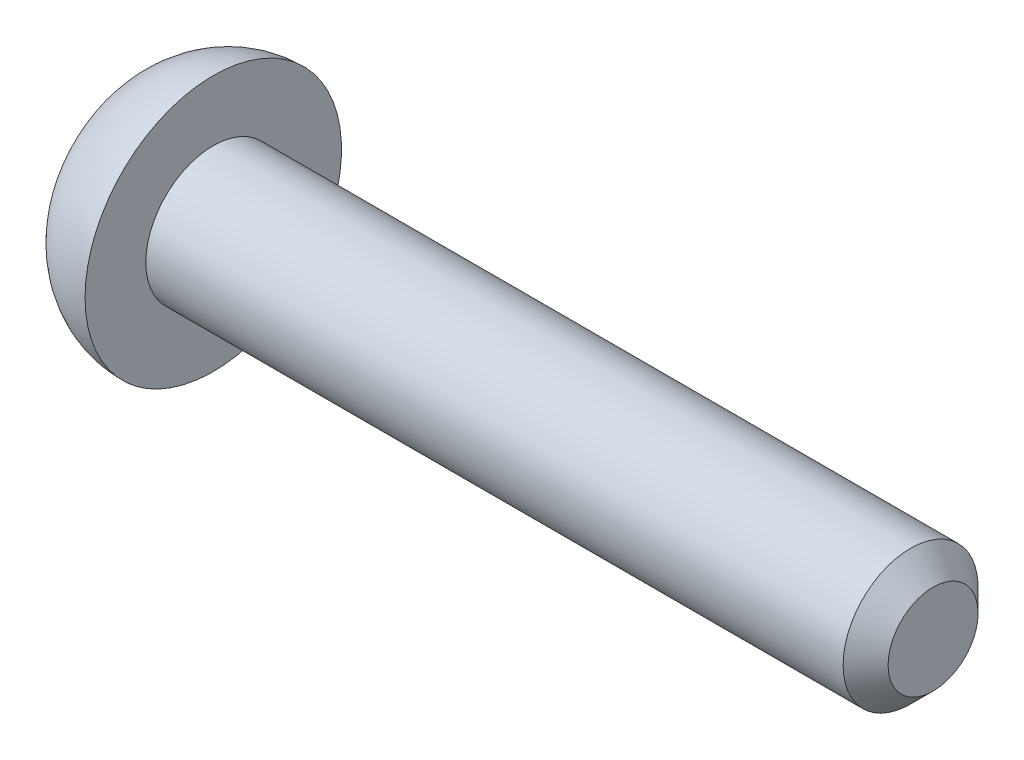
ISO-10303-21;
HEADER;
FILE_DESCRIPTION(('STEP AP214'),'2;1');
FILE_NAME('part.step','',(''),(''),'','','');
FILE_SCHEMA(('AUTOMOTIVE_DESIGN { 1 0 10303 214 1 1 1 1 }'));
ENDSEC;
DATA;
#1=APPLICATION_CONTEXT('core data for automotive mechanical design processes');
#2=APPLICATION_PROTOCOL_DEFINITION('international standard','automotive_design',2000,#1);
#3=PRODUCT_CONTEXT('',#1,'mechanical');
#4=PRODUCT('Part','Part','',(#3));
#5=PRODUCT_RELATED_PRODUCT_CATEGORY('part','',(#4));
#6=PRODUCT_DEFINITION_FORMATION('','',#4);
#7=PRODUCT_DEFINITION_CONTEXT('part definition',#1,'design');
#8=PRODUCT_DEFINITION('design','',#6,#7);
#9=PRODUCT_DEFINITION_SHAPE('','',#8);
#10=(LENGTH_UNIT() NAMED_UNIT(*) SI_UNIT(.MILLI.,.METRE.));
#11=(NAMED_UNIT(*) PLANE_ANGLE_UNIT() SI_UNIT($,.RADIAN.));
#12=(NAMED_UNIT(*) SI_UNIT($,.STERADIAN.) SOLID_ANGLE_UNIT());
#13=UNCERTAINTY_MEASURE_WITH_UNIT(LENGTH_MEASURE(1.E-05),#10,'distance_accuracy_value','');
#14=(GEOMETRIC_REPRESENTATION_CONTEXT(3) GLOBAL_UNCERTAINTY_ASSIGNED_CONTEXT((#13)) GLOBAL_UNIT_ASSIGNED_CONTEXT((#10,
#11,#12)) REPRESENTATION_CONTEXT('',''));
#15=CARTESIAN_POINT('',(0.,0.,0.));
#16=DIRECTION('',(0.,0.,1.));
#17=DIRECTION('',(1.,0.,0.));
#18=AXIS2_PLACEMENT_3D('',#15,#16,#17);
#19=CARTESIAN_POINT('',(-17.65,0.,-2.04903810567667));
#20=DIRECTION('',(1.,0.,0.));
#21=DIRECTION('',(0.,0.,-1.));
#22=AXIS2_PLACEMENT_3D('',#19,#20,#21);
#23=PLANE('',#22);
#24=CARTESIAN_POINT('',(-17.65,0.,0.));
#25=DIRECTION('',(-1.,0.,0.));
#26=DIRECTION('',(0.,0.,1.));
#27=AXIS2_PLACEMENT_3D('',#24,#25,#26);
#28=CIRCLE('',#27,2.04903810567666);
#29=CARTESIAN_POINT('',(-17.65,0.,2.04903810567666));
#30=VERTEX_POINT('',#29);
#31=EDGE_CURVE('E213',#30,#30,#28,.T.);
#32=ORIENTED_EDGE('',*,*,#31,.T.);
#33=EDGE_LOOP('',(#32));
#34=FACE_BOUND('',#33,.T.);
#35=CARTESIAN_POINT('',(-17.65,2.04903810567666,0.));
#36=DIRECTION('',(1.,0.,0.));
#37=DIRECTION('',(0.,0.,1.));
#38=AXIS2_PLACEMENT_3D('',#35,#36,#37);
#39=CIRCLE('',#38,1.02907378905691);
#40=CARTESIAN_POINT('',(-17.65,1.20759961003623,0.592430689092257));
#41=VERTEX_POINT('',#40);
#42=CARTESIAN_POINT('',(-17.65,1.20759961003623,-0.592430689092258));
#43=VERTEX_POINT('',#42);
#44=EDGE_CURVE('E159',#41,#43,#39,.T.);
#45=ORIENTED_EDGE('',*,*,#44,.F.);
#46=CARTESIAN_POINT('',(-17.65,1.12583302491977,0.650000000000001));
#47=DIRECTION('',(-1.,0.,0.));
#48=DIRECTION('',(0.,0.,1.));
#49=AXIS2_PLACEMENT_3D('',#46,#47,#48);
#50=CIRCLE('',#49,0.1);
#51=CARTESIAN_POINT('',(-17.65,1.11685983175353,0.74959659534543));
#52=VERTEX_POINT('',#51);
#53=EDGE_CURVE('E49',#52,#41,#50,.T.);
#54=ORIENTED_EDGE('',*,*,#53,.F.);
#55=CARTESIAN_POINT('',(-17.65,1.02451905283833,1.77451905283833));
#56=DIRECTION('',(1.,0.,0.));
#57=DIRECTION('',(0.,0.,1.));
#58=AXIS2_PLACEMENT_3D('',#55,#56,#57);
#59=CIRCLE('',#58,1.02907378905691);
#60=CARTESIAN_POINT('',(-17.65,0.0907397782827011,1.34202728443769));
#61=VERTEX_POINT('',#60);
#62=EDGE_CURVE('E186',#61,#52,#59,.T.);
#63=ORIENTED_EDGE('',*,*,#62,.F.);
#64=CARTESIAN_POINT('',(-17.65,0.,1.3));
#65=DIRECTION('',(-1.,0.,0.));
#66=DIRECTION('',(0.,0.,1.));
#67=AXIS2_PLACEMENT_3D('',#64,#65,#66);
#68=CIRCLE('',#67,0.1);
#69=CARTESIAN_POINT('',(-17.65,-0.0907397782827009,1.34202728443769));
#70=VERTEX_POINT('',#69);
#71=EDGE_CURVE('E184',#70,#61,#68,.T.);
#72=ORIENTED_EDGE('',*,*,#71,.F.);
#73=CARTESIAN_POINT('',(-17.65,-1.02451905283833,1.77451905283833));
#74=DIRECTION('',(1.,0.,0.));
#75=DIRECTION('',(0.,0.,1.));
#76=AXIS2_PLACEMENT_3D('',#73,#74,#75);
#77=CIRCLE('',#76,1.02907378905691);
#78=CARTESIAN_POINT('',(-17.65,-1.11685983175353,0.74959659534543));
#79=VERTEX_POINT('',#78);
#80=EDGE_CURVE('E133',#79,#70,#77,.T.);
#81=ORIENTED_EDGE('',*,*,#80,.F.);
#82=CARTESIAN_POINT('',(-17.65,-1.12583302491977,0.650000000000001));
#83=DIRECTION('',(-1.,0.,0.));
#84=DIRECTION('',(0.,0.,-1.));
#85=AXIS2_PLACEMENT_3D('',#82,#83,#84);
#86=CIRCLE('',#85,0.0999999999999997);
#87=CARTESIAN_POINT('',(-17.65,-1.20759961003623,0.592430689092258));
#88=VERTEX_POINT('',#87);
#89=EDGE_CURVE('E180',#88,#79,#86,.T.);
#90=ORIENTED_EDGE('',*,*,#89,.F.);
#91=CARTESIAN_POINT('',(-17.65,-2.04903810567666,0.));
#92=DIRECTION('',(1.,0.,0.));
#93=DIRECTION('',(0.,0.,-1.));
#94=AXIS2_PLACEMENT_3D('',#91,#92,#93);
#95=CIRCLE('',#94,1.02907378905691);
#96=CARTESIAN_POINT('',(-17.65,-1.20759961003623,-0.592430689092258));
#97=VERTEX_POINT('',#96);
#98=EDGE_CURVE('E177',#97,#88,#95,.T.);
#99=ORIENTED_EDGE('',*,*,#98,.F.);
#100=CARTESIAN_POINT('',(-17.65,-1.12583302491977,-0.650000000000001));
#101=DIRECTION('',(-1.,0.,0.));
#102=DIRECTION('',(0.,0.,1.));
#103=AXIS2_PLACEMENT_3D('',#100,#101,#102);
#104=CIRCLE('',#103,0.0999999999999999);
#105=CARTESIAN_POINT('',(-17.65,-1.11685983175353,-0.749596595345431));
#106=VERTEX_POINT('',#105);
#107=EDGE_CURVE('E174',#106,#97,#104,.T.);
#108=ORIENTED_EDGE('',*,*,#107,.F.);
#109=CARTESIAN_POINT('',(-17.65,-1.02451905283833,-1.77451905283833));
#110=DIRECTION('',(1.,0.,0.));
#111=DIRECTION('',(0.,0.,1.));
#112=AXIS2_PLACEMENT_3D('',#109,#110,#111);
#113=CIRCLE('',#112,1.02907378905691);
#114=CARTESIAN_POINT('',(-17.65,-0.0907397782827007,-1.34202728443769));
#115=VERTEX_POINT('',#114);
#116=EDGE_CURVE('E171',#115,#106,#113,.T.);
#117=ORIENTED_EDGE('',*,*,#116,.F.);
#118=CARTESIAN_POINT('',(-17.65,0.,-1.3));
#119=DIRECTION('',(-1.,0.,0.));
#120=DIRECTION('',(0.,0.,1.));
#121=AXIS2_PLACEMENT_3D('',#118,#119,#120);
#122=CIRCLE('',#121,0.1);
#123=CARTESIAN_POINT('',(-17.65,0.0907397782827007,-1.34202728443769));
#124=VERTEX_POINT('',#123);
#125=EDGE_CURVE('E168',#124,#115,#122,.T.);
#126=ORIENTED_EDGE('',*,*,#125,.F.);
#127=CARTESIAN_POINT('',(-17.65,1.02451905283833,-1.77451905283833));
#128=DIRECTION('',(1.,0.,0.));
#129=DIRECTION('',(0.,0.,1.));
#130=AXIS2_PLACEMENT_3D('',#127,#128,#129);
#131=CIRCLE('',#130,1.02907378905691);
#132=CARTESIAN_POINT('',(-17.65,1.11685983175353,-0.74959659534543));
#133=VERTEX_POINT('',#132);
#134=EDGE_CURVE('E165',#133,#124,#131,.T.);
#135=ORIENTED_EDGE('',*,*,#134,.F.);
#136=CARTESIAN_POINT('',(-17.65,1.12583302491977,-0.650000000000001));
#137=DIRECTION('',(-1.,0.,0.));
#138=DIRECTION('',(0.,0.,-1.));
#139=AXIS2_PLACEMENT_3D('',#136,#137,#138);
#140=CIRCLE('',#139,0.0999999999999998);
#141=EDGE_CURVE('E162',#43,#133,#140,.T.);
#142=ORIENTED_EDGE('',*,*,#141,.F.);
#143=EDGE_LOOP('',(#45,#54,#63,#72,#81,#90,#99,#108,#117,#126,#135,#142));
#144=FACE_BOUND('',#143,.T.);
#145=ADVANCED_FACE('F34',(#34,#144),#23,.F.);
#146=CARTESIAN_POINT('',(-16.,0.,0.));
#147=DIRECTION('',(-1.,0.,0.));
#148=DIRECTION('',(0.,0.,1.));
#149=AXIS2_PLACEMENT_3D('',#146,#147,#148);
#150=DEGENERATE_TOROIDAL_SURFACE('',#149,0.749999999999999,2.1,.T.);
#151=ORIENTED_EDGE('',*,*,#31,.F.);
#152=EDGE_LOOP('',(#151));
#153=FACE_BOUND('',#152,.T.);
#154=CARTESIAN_POINT('',(-16.,0.,0.));
#155=DIRECTION('',(-1.,0.,0.));
#156=DIRECTION('',(0.,0.,1.));
#157=AXIS2_PLACEMENT_3D('',#154,#155,#156);
#158=CIRCLE('',#157,2.85);
#159=CARTESIAN_POINT('',(-16.,0.,2.85));
#160=VERTEX_POINT('',#159);
#161=EDGE_CURVE('E210',#160,#160,#158,.T.);
#162=ORIENTED_EDGE('',*,*,#161,.T.);
#163=EDGE_LOOP('',(#162));
#164=FACE_BOUND('',#163,.T.);
#165=ADVANCED_FACE('F235',(#153,#164),#150,.T.);
#166=CARTESIAN_POINT('',(-16.,0.,-2.85));
#167=DIRECTION('',(-1.,0.,0.));
#168=DIRECTION('',(0.,0.,1.));
#169=AXIS2_PLACEMENT_3D('',#166,#167,#168);
#170=PLANE('',#169);
#171=ORIENTED_EDGE('',*,*,#161,.F.);
#172=EDGE_LOOP('',(#171));
#173=FACE_BOUND('',#172,.T.);
#174=CARTESIAN_POINT('',(-16.,0.,0.));
#175=DIRECTION('',(-1.,0.,0.));
#176=DIRECTION('',(0.,0.,1.));
#177=AXIS2_PLACEMENT_3D('',#174,#175,#176);
#178=CIRCLE('',#177,1.5);
#179=CARTESIAN_POINT('',(-16.,0.,1.5));
#180=VERTEX_POINT('',#179);
#181=EDGE_CURVE('E190',#180,#180,#178,.T.);
#182=ORIENTED_EDGE('',*,*,#181,.T.);
#183=EDGE_LOOP('',(#182));
#184=FACE_BOUND('',#183,.T.);
#185=ADVANCED_FACE('F240',(#173,#184),#170,.F.);
#186=CARTESIAN_POINT('',(-17.65,0.,0.));
#187=DIRECTION('',(-1.,0.,0.));
#188=DIRECTION('',(0.,0.,1.));
#189=AXIS2_PLACEMENT_3D('',#186,#187,#188);
#190=CYLINDRICAL_SURFACE('',#189,1.5);
#191=CARTESIAN_POINT('',(-0.5,0.,0.));
#192=DIRECTION('',(-1.,0.,0.));
#193=DIRECTION('',(0.,0.,1.));
#194=AXIS2_PLACEMENT_3D('',#191,#192,#193);
#195=CIRCLE('',#194,1.5);
#196=CARTESIAN_POINT('',(-0.5,0.,1.5));
#197=VERTEX_POINT('',#196);
#198=EDGE_CURVE('E42',#197,#197,#195,.T.);
#199=ORIENTED_EDGE('',*,*,#198,.T.);
#200=EDGE_LOOP('',(#199));
#201=FACE_BOUND('',#200,.T.);
#202=ORIENTED_EDGE('',*,*,#181,.F.);
#203=EDGE_LOOP('',(#202));
#204=FACE_BOUND('',#203,.T.);
#205=ADVANCED_FACE('F218',(#201,#204),#190,.T.);
#206=CARTESIAN_POINT('',(0.,0.,0.));
#207=DIRECTION('',(-1.,0.,0.));
#208=DIRECTION('',(0.,0.,1.));
#209=AXIS2_PLACEMENT_3D('',#206,#207,#208);
#210=PLANE('',#209);
#211=CARTESIAN_POINT('',(0.,0.,0.));
#212=DIRECTION('',(-1.,0.,0.));
#213=DIRECTION('',(0.,0.,1.));
#214=AXIS2_PLACEMENT_3D('',#211,#212,#213);
#215=CIRCLE('',#214,0.999999999999996);
#216=CARTESIAN_POINT('',(0.,0.,0.999999999999996));
#217=VERTEX_POINT('',#216);
#218=EDGE_CURVE('E11',#217,#217,#215,.F.);
#219=ORIENTED_EDGE('',*,*,#218,.T.);
#220=EDGE_LOOP('',(#219));
#221=FACE_BOUND('',#220,.T.);
#222=ADVANCED_FACE('F223',(#221),#210,.F.);
#223=CARTESIAN_POINT('',(-0.5,0.,0.));
#224=DIRECTION('',(-1.,0.,0.));
#225=DIRECTION('',(0.,0.,1.));
#226=AXIS2_PLACEMENT_3D('',#223,#224,#225);
#227=CONICAL_SURFACE('',#226,1.5,0.785398163397451);
#228=ORIENTED_EDGE('',*,*,#218,.F.);
#229=EDGE_LOOP('',(#228));
#230=FACE_BOUND('',#229,.T.);
#231=ORIENTED_EDGE('',*,*,#198,.F.);
#232=EDGE_LOOP('',(#231));
#233=FACE_BOUND('',#232,.T.);
#234=ADVANCED_FACE('F36',(#230,#233),#227,.T.);
#235=CARTESIAN_POINT('',(-16.65,1.12583302491977,0.650000000000001));
#236=DIRECTION('',(-1.,0.,0.));
#237=DIRECTION('',(0.,0.,1.));
#238=AXIS2_PLACEMENT_3D('',#235,#236,#237);
#239=CYLINDRICAL_SURFACE('',#238,0.1);
#240=ORIENTED_EDGE('',*,*,#53,.T.);
#241=DIRECTION('',(-1.,0.,0.));
#242=VECTOR('',#241,1.);
#243=CARTESIAN_POINT('',(-16.65,1.20759961003623,0.592430689092257));
#244=LINE('',#243,#242);
#245=CARTESIAN_POINT('',(-16.65,1.20759961003623,0.592430689092257));
#246=VERTEX_POINT('',#245);
#247=EDGE_CURVE('E97',#246,#41,#244,.T.);
#248=ORIENTED_EDGE('',*,*,#247,.F.);
#249=CARTESIAN_POINT('',(-16.65,1.12583302491977,0.650000000000001));
#250=DIRECTION('',(-1.,0.,0.));
#251=DIRECTION('',(0.,0.,1.));
#252=AXIS2_PLACEMENT_3D('',#249,#250,#251);
#253=CIRCLE('',#252,0.1);
#254=CARTESIAN_POINT('',(-16.65,1.11685983175353,0.74959659534543));
#255=VERTEX_POINT('',#254);
#256=EDGE_CURVE('E188',#255,#246,#253,.T.);
#257=ORIENTED_EDGE('',*,*,#256,.F.);
#258=DIRECTION('',(-1.,0.,0.));
#259=VECTOR('',#258,1.);
#260=CARTESIAN_POINT('',(-16.65,1.11685983175353,0.74959659534543));
#261=LINE('',#260,#259);
#262=EDGE_CURVE('E57',#255,#52,#261,.T.);
#263=ORIENTED_EDGE('',*,*,#262,.T.);
#264=EDGE_LOOP('',(#240,#248,#257,#263));
#265=FACE_BOUND('',#264,.T.);
#266=ADVANCED_FACE('F222',(#265),#239,.F.);
#267=CARTESIAN_POINT('',(-16.65,1.02451905283833,1.77451905283833));
#268=DIRECTION('',(-1.,0.,0.));
#269=DIRECTION('',(0.,0.,1.));
#270=AXIS2_PLACEMENT_3D('',#267,#268,#269);
#271=CYLINDRICAL_SURFACE('',#270,1.02907378905691);
#272=ORIENTED_EDGE('',*,*,#62,.T.);
#273=ORIENTED_EDGE('',*,*,#262,.F.);
#274=CARTESIAN_POINT('',(-16.65,1.02451905283833,1.77451905283833));
#275=DIRECTION('',(1.,0.,0.));
#276=DIRECTION('',(0.,0.,1.));
#277=AXIS2_PLACEMENT_3D('',#274,#275,#276);
#278=CIRCLE('',#277,1.02907378905691);
#279=CARTESIAN_POINT('',(-16.65,0.0907397782827011,1.34202728443769));
#280=VERTEX_POINT('',#279);
#281=EDGE_CURVE('E145',#280,#255,#278,.T.);
#282=ORIENTED_EDGE('',*,*,#281,.F.);
#283=DIRECTION('',(-1.,0.,0.));
#284=VECTOR('',#283,1.);
#285=CARTESIAN_POINT('',(-16.65,0.0907397782827011,1.34202728443769));
#286=LINE('',#285,#284);
#287=EDGE_CURVE('E137',#280,#61,#286,.T.);
#288=ORIENTED_EDGE('',*,*,#287,.T.);
#289=EDGE_LOOP('',(#272,#273,#282,#288));
#290=FACE_BOUND('',#289,.T.);
#291=ADVANCED_FACE('F229',(#290),#271,.T.);
#292=CARTESIAN_POINT('',(-16.65,0.,1.3));
#293=DIRECTION('',(-1.,0.,0.));
#294=DIRECTION('',(0.,0.,1.));
#295=AXIS2_PLACEMENT_3D('',#292,#293,#294);
#296=CYLINDRICAL_SURFACE('',#295,0.1);
#297=ORIENTED_EDGE('',*,*,#71,.T.);
#298=ORIENTED_EDGE('',*,*,#287,.F.);
#299=CARTESIAN_POINT('',(-16.65,0.,1.3));
#300=DIRECTION('',(-1.,0.,0.));
#301=DIRECTION('',(0.,0.,1.));
#302=AXIS2_PLACEMENT_3D('',#299,#300,#301);
#303=CIRCLE('',#302,0.1);
#304=CARTESIAN_POINT('',(-16.65,-0.0907397782827009,1.34202728443769));
#305=VERTEX_POINT('',#304);
#306=EDGE_CURVE('E141',#305,#280,#303,.T.);
#307=ORIENTED_EDGE('',*,*,#306,.F.);
#308=DIRECTION('',(-1.,0.,0.));
#309=VECTOR('',#308,1.);
#310=CARTESIAN_POINT('',(-16.65,-0.0907397782827009,1.34202728443769));
#311=LINE('',#310,#309);
#312=EDGE_CURVE('E126',#305,#70,#311,.T.);
#313=ORIENTED_EDGE('',*,*,#312,.T.);
#314=EDGE_LOOP('',(#297,#298,#307,#313));
#315=FACE_BOUND('',#314,.T.);
#316=ADVANCED_FACE('F142',(#315),#296,.F.);
#317=CARTESIAN_POINT('',(-16.65,-1.02451905283833,1.77451905283833));
#318=DIRECTION('',(-1.,0.,0.));
#319=DIRECTION('',(0.,0.,1.));
#320=AXIS2_PLACEMENT_3D('',#317,#318,#319);
#321=CYLINDRICAL_SURFACE('',#320,1.02907378905691);
#322=ORIENTED_EDGE('',*,*,#80,.T.);
#323=ORIENTED_EDGE('',*,*,#312,.F.);
#324=CARTESIAN_POINT('',(-16.65,-1.02451905283833,1.77451905283833));
#325=DIRECTION('',(1.,0.,0.));
#326=DIRECTION('',(0.,0.,1.));
#327=AXIS2_PLACEMENT_3D('',#324,#325,#326);
#328=CIRCLE('',#327,1.02907378905691);
#329=CARTESIAN_POINT('',(-16.65,-1.11685983175353,0.74959659534543));
#330=VERTEX_POINT('',#329);
#331=EDGE_CURVE('E130',#330,#305,#328,.T.);
#332=ORIENTED_EDGE('',*,*,#331,.F.);
#333=DIRECTION('',(-1.,0.,0.));
#334=VECTOR('',#333,1.);
#335=CARTESIAN_POINT('',(-16.65,-1.11685983175353,0.74959659534543));
#336=LINE('',#335,#334);
#337=EDGE_CURVE('E138',#330,#79,#336,.T.);
#338=ORIENTED_EDGE('',*,*,#337,.T.);
#339=EDGE_LOOP('',(#322,#323,#332,#338));
#340=FACE_BOUND('',#339,.T.);
#341=ADVANCED_FACE('F128',(#340),#321,.T.);
#342=CARTESIAN_POINT('',(-16.65,-1.12583302491977,0.650000000000001));
#343=DIRECTION('',(-1.,0.,0.));
#344=DIRECTION('',(0.,0.,1.));
#345=AXIS2_PLACEMENT_3D('',#342,#343,#344);
#346=CYLINDRICAL_SURFACE('',#345,0.0999999999999997);
#347=ORIENTED_EDGE('',*,*,#89,.T.);
#348=ORIENTED_EDGE('',*,*,#337,.F.);
#349=CARTESIAN_POINT('',(-16.65,-1.12583302491977,0.650000000000001));
#350=DIRECTION('',(-1.,0.,0.));
#351=DIRECTION('',(0.,0.,-1.));
#352=AXIS2_PLACEMENT_3D('',#349,#350,#351);
#353=CIRCLE('',#352,0.0999999999999997);
#354=CARTESIAN_POINT('',(-16.65,-1.20759961003623,0.592430689092258));
#355=VERTEX_POINT('',#354);
#356=EDGE_CURVE('E151',#355,#330,#353,.T.);
#357=ORIENTED_EDGE('',*,*,#356,.F.);
#358=DIRECTION('',(-1.,0.,0.));
#359=VECTOR('',#358,1.);
#360=CARTESIAN_POINT('',(-16.65,-1.20759961003623,0.592430689092258));
#361=LINE('',#360,#359);
#362=EDGE_CURVE('E193',#355,#88,#361,.T.);
#363=ORIENTED_EDGE('',*,*,#362,.T.);
#364=EDGE_LOOP('',(#347,#348,#357,#363));
#365=FACE_BOUND('',#364,.T.);
#366=ADVANCED_FACE('F277',(#365),#346,.F.);
#367=CARTESIAN_POINT('',(-16.65,-2.04903810567666,0.));
#368=DIRECTION('',(-1.,0.,0.));
#369=DIRECTION('',(0.,0.,1.));
#370=AXIS2_PLACEMENT_3D('',#367,#368,#369);
#371=CYLINDRICAL_SURFACE('',#370,1.02907378905691);
#372=ORIENTED_EDGE('',*,*,#98,.T.);
#373=ORIENTED_EDGE('',*,*,#362,.F.);
#374=CARTESIAN_POINT('',(-16.65,-2.04903810567666,0.));
#375=DIRECTION('',(1.,0.,0.));
#376=DIRECTION('',(0.,0.,-1.));
#377=AXIS2_PLACEMENT_3D('',#374,#375,#376);
#378=CIRCLE('',#377,1.02907378905691);
#379=CARTESIAN_POINT('',(-16.65,-1.20759961003623,-0.592430689092258));
#380=VERTEX_POINT('',#379);
#381=EDGE_CURVE('E153',#380,#355,#378,.T.);
#382=ORIENTED_EDGE('',*,*,#381,.F.);
#383=DIRECTION('',(-1.,0.,0.));
#384=VECTOR('',#383,1.);
#385=CARTESIAN_POINT('',(-16.65,-1.20759961003623,-0.592430689092258));
#386=LINE('',#385,#384);
#387=EDGE_CURVE('E195',#380,#97,#386,.T.);
#388=ORIENTED_EDGE('',*,*,#387,.T.);
#389=EDGE_LOOP('',(#372,#373,#382,#388));
#390=FACE_BOUND('',#389,.T.);
#391=ADVANCED_FACE('F273',(#390),#371,.T.);
#392=CARTESIAN_POINT('',(-16.65,-1.12583302491977,-0.650000000000001));
#393=DIRECTION('',(-1.,0.,0.));
#394=DIRECTION('',(0.,0.,1.));
#395=AXIS2_PLACEMENT_3D('',#392,#393,#394);
#396=CYLINDRICAL_SURFACE('',#395,0.0999999999999999);
#397=ORIENTED_EDGE('',*,*,#107,.T.);
#398=ORIENTED_EDGE('',*,*,#387,.F.);
#399=CARTESIAN_POINT('',(-16.65,-1.12583302491977,-0.650000000000001));
#400=DIRECTION('',(-1.,0.,0.));
#401=DIRECTION('',(0.,0.,1.));
#402=AXIS2_PLACEMENT_3D('',#399,#400,#401);
#403=CIRCLE('',#402,0.0999999999999999);
#404=CARTESIAN_POINT('',(-16.65,-1.11685983175353,-0.749596595345431));
#405=VERTEX_POINT('',#404);
#406=EDGE_CURVE('E421',#405,#380,#403,.T.);
#407=ORIENTED_EDGE('',*,*,#406,.F.);
#408=DIRECTION('',(-1.,0.,0.));
#409=VECTOR('',#408,1.);
#410=CARTESIAN_POINT('',(-16.65,-1.11685983175353,-0.749596595345431));
#411=LINE('',#410,#409);
#412=EDGE_CURVE('E197',#405,#106,#411,.T.);
#413=ORIENTED_EDGE('',*,*,#412,.T.);
#414=EDGE_LOOP('',(#397,#398,#407,#413));
#415=FACE_BOUND('',#414,.T.);
#416=ADVANCED_FACE('F269',(#415),#396,.F.);
#417=CARTESIAN_POINT('',(-16.65,-1.02451905283833,-1.77451905283833));
#418=DIRECTION('',(-1.,0.,0.));
#419=DIRECTION('',(0.,0.,1.));
#420=AXIS2_PLACEMENT_3D('',#417,#418,#419);
#421=CYLINDRICAL_SURFACE('',#420,1.02907378905691);
#422=ORIENTED_EDGE('',*,*,#116,.T.);
#423=ORIENTED_EDGE('',*,*,#412,.F.);
#424=CARTESIAN_POINT('',(-16.65,-1.02451905283833,-1.77451905283833));
#425=DIRECTION('',(1.,0.,0.));
#426=DIRECTION('',(0.,0.,1.));
#427=AXIS2_PLACEMENT_3D('',#424,#425,#426);
#428=CIRCLE('',#427,1.02907378905691);
#429=CARTESIAN_POINT('',(-16.65,-0.0907397782827007,-1.34202728443769));
#430=VERTEX_POINT('',#429);
#431=EDGE_CURVE('E418',#430,#405,#428,.T.);
#432=ORIENTED_EDGE('',*,*,#431,.F.);
#433=DIRECTION('',(-1.,0.,0.));
#434=VECTOR('',#433,1.);
#435=CARTESIAN_POINT('',(-16.65,-0.0907397782827007,-1.34202728443769));
#436=LINE('',#435,#434);
#437=EDGE_CURVE('E199',#430,#115,#436,.T.);
#438=ORIENTED_EDGE('',*,*,#437,.T.);
#439=EDGE_LOOP('',(#422,#423,#432,#438));
#440=FACE_BOUND('',#439,.T.);
#441=ADVANCED_FACE('F265',(#440),#421,.T.);
#442=CARTESIAN_POINT('',(-16.65,0.,-1.3));
#443=DIRECTION('',(-1.,0.,0.));
#444=DIRECTION('',(0.,0.,1.));
#445=AXIS2_PLACEMENT_3D('',#442,#443,#444);
#446=CYLINDRICAL_SURFACE('',#445,0.1);
#447=ORIENTED_EDGE('',*,*,#125,.T.);
#448=ORIENTED_EDGE('',*,*,#437,.F.);
#449=CARTESIAN_POINT('',(-16.65,0.,-1.3));
#450=DIRECTION('',(-1.,0.,0.));
#451=DIRECTION('',(0.,0.,1.));
#452=AXIS2_PLACEMENT_3D('',#449,#450,#451);
#453=CIRCLE('',#452,0.1);
#454=CARTESIAN_POINT('',(-16.65,0.0907397782827007,-1.34202728443769));
#455=VERTEX_POINT('',#454);
#456=EDGE_CURVE('E415',#455,#430,#453,.T.);
#457=ORIENTED_EDGE('',*,*,#456,.F.);
#458=DIRECTION('',(-1.,0.,0.));
#459=VECTOR('',#458,1.);
#460=CARTESIAN_POINT('',(-16.65,0.0907397782827007,-1.34202728443769));
#461=LINE('',#460,#459);
#462=EDGE_CURVE('E201',#455,#124,#461,.T.);
#463=ORIENTED_EDGE('',*,*,#462,.T.);
#464=EDGE_LOOP('',(#447,#448,#457,#463));
#465=FACE_BOUND('',#464,.T.);
#466=ADVANCED_FACE('F261',(#465),#446,.F.);
#467=CARTESIAN_POINT('',(-16.65,1.02451905283833,-1.77451905283833));
#468=DIRECTION('',(-1.,0.,0.));
#469=DIRECTION('',(0.,0.,1.));
#470=AXIS2_PLACEMENT_3D('',#467,#468,#469);
#471=CYLINDRICAL_SURFACE('',#470,1.02907378905691);
#472=ORIENTED_EDGE('',*,*,#134,.T.);
#473=ORIENTED_EDGE('',*,*,#462,.F.);
#474=CARTESIAN_POINT('',(-16.65,1.02451905283833,-1.77451905283833));
#475=DIRECTION('',(1.,0.,0.));
#476=DIRECTION('',(0.,0.,1.));
#477=AXIS2_PLACEMENT_3D('',#474,#475,#476);
#478=CIRCLE('',#477,1.02907378905691);
#479=CARTESIAN_POINT('',(-16.65,1.11685983175353,-0.74959659534543));
#480=VERTEX_POINT('',#479);
#481=EDGE_CURVE('E412',#480,#455,#478,.T.);
#482=ORIENTED_EDGE('',*,*,#481,.F.);
#483=DIRECTION('',(-1.,0.,0.));
#484=VECTOR('',#483,1.);
#485=CARTESIAN_POINT('',(-16.65,1.11685983175353,-0.74959659534543));
#486=LINE('',#485,#484);
#487=EDGE_CURVE('E203',#480,#133,#486,.T.);
#488=ORIENTED_EDGE('',*,*,#487,.T.);
#489=EDGE_LOOP('',(#472,#473,#482,#488));
#490=FACE_BOUND('',#489,.T.);
#491=ADVANCED_FACE('F257',(#490),#471,.T.);
#492=CARTESIAN_POINT('',(-16.65,1.12583302491977,-0.650000000000001));
#493=DIRECTION('',(-1.,0.,0.));
#494=DIRECTION('',(0.,0.,1.));
#495=AXIS2_PLACEMENT_3D('',#492,#493,#494);
#496=CYLINDRICAL_SURFACE('',#495,0.0999999999999998);
#497=ORIENTED_EDGE('',*,*,#141,.T.);
#498=ORIENTED_EDGE('',*,*,#487,.F.);
#499=CARTESIAN_POINT('',(-16.65,1.12583302491977,-0.650000000000001));
#500=DIRECTION('',(-1.,0.,0.));
#501=DIRECTION('',(0.,0.,-1.));
#502=AXIS2_PLACEMENT_3D('',#499,#500,#501);
#503=CIRCLE('',#502,0.0999999999999998);
#504=CARTESIAN_POINT('',(-16.65,1.20759961003623,-0.592430689092258));
#505=VERTEX_POINT('',#504);
#506=EDGE_CURVE('E407',#505,#480,#503,.T.);
#507=ORIENTED_EDGE('',*,*,#506,.F.);
#508=DIRECTION('',(-1.,0.,0.));
#509=VECTOR('',#508,1.);
#510=CARTESIAN_POINT('',(-16.65,1.20759961003623,-0.592430689092258));
#511=LINE('',#510,#509);
#512=EDGE_CURVE('E205',#505,#43,#511,.T.);
#513=ORIENTED_EDGE('',*,*,#512,.T.);
#514=EDGE_LOOP('',(#497,#498,#507,#513));
#515=FACE_BOUND('',#514,.T.);
#516=ADVANCED_FACE('F253',(#515),#496,.F.);
#517=CARTESIAN_POINT('',(-16.65,2.04903810567666,0.));
#518=DIRECTION('',(-1.,0.,0.));
#519=DIRECTION('',(0.,0.,1.));
#520=AXIS2_PLACEMENT_3D('',#517,#518,#519);
#521=CYLINDRICAL_SURFACE('',#520,1.02907378905691);
#522=ORIENTED_EDGE('',*,*,#44,.T.);
#523=ORIENTED_EDGE('',*,*,#512,.F.);
#524=CARTESIAN_POINT('',(-16.65,2.04903810567666,0.));
#525=DIRECTION('',(1.,0.,0.));
#526=DIRECTION('',(0.,0.,1.));
#527=AXIS2_PLACEMENT_3D('',#524,#525,#526);
#528=CIRCLE('',#527,1.02907378905691);
#529=EDGE_CURVE('E405',#246,#505,#528,.T.);
#530=ORIENTED_EDGE('',*,*,#529,.F.);
#531=ORIENTED_EDGE('',*,*,#247,.T.);
#532=EDGE_LOOP('',(#522,#523,#530,#531));
#533=FACE_BOUND('',#532,.T.);
#534=ADVANCED_FACE('F250',(#533),#521,.T.);
#535=CARTESIAN_POINT('',(-16.65,1.58743556529821,0.325));
#536=DIRECTION('',(-1.,0.,0.));
#537=DIRECTION('',(0.,0.,1.));
#538=AXIS2_PLACEMENT_3D('',#535,#536,#537);
#539=PLANE('',#538);
#540=ORIENTED_EDGE('',*,*,#256,.T.);
#541=ORIENTED_EDGE('',*,*,#529,.T.);
#542=ORIENTED_EDGE('',*,*,#506,.T.);
#543=ORIENTED_EDGE('',*,*,#481,.T.);
#544=ORIENTED_EDGE('',*,*,#456,.T.);
#545=ORIENTED_EDGE('',*,*,#431,.T.);
#546=ORIENTED_EDGE('',*,*,#406,.T.);
#547=ORIENTED_EDGE('',*,*,#381,.T.);
#548=ORIENTED_EDGE('',*,*,#356,.T.);
#549=ORIENTED_EDGE('',*,*,#331,.T.);
#550=ORIENTED_EDGE('',*,*,#306,.T.);
#551=ORIENTED_EDGE('',*,*,#281,.T.);
#552=EDGE_LOOP('',(#540,#541,#542,#543,#544,#545,#546,#547,#548,#549,#550,#551));
#553=FACE_BOUND('',#552,.T.);
#554=ADVANCED_FACE('F148',(#553),#539,.T.);
#555=CLOSED_SHELL('',(#145,#165,#185,#205,#222,#234,#266,#291,#316,#341,#366,#391,#416,#441,
#466,#491,#516,#534,#554));
#556=MANIFOLD_SOLID_BREP('B2',#555);
#557=ADVANCED_BREP_SHAPE_REPRESENTATION('',(#18,#556),#14);
#558=SHAPE_DEFINITION_REPRESENTATION(#9,#557);
ENDSEC;
END-ISO-10303-21;
